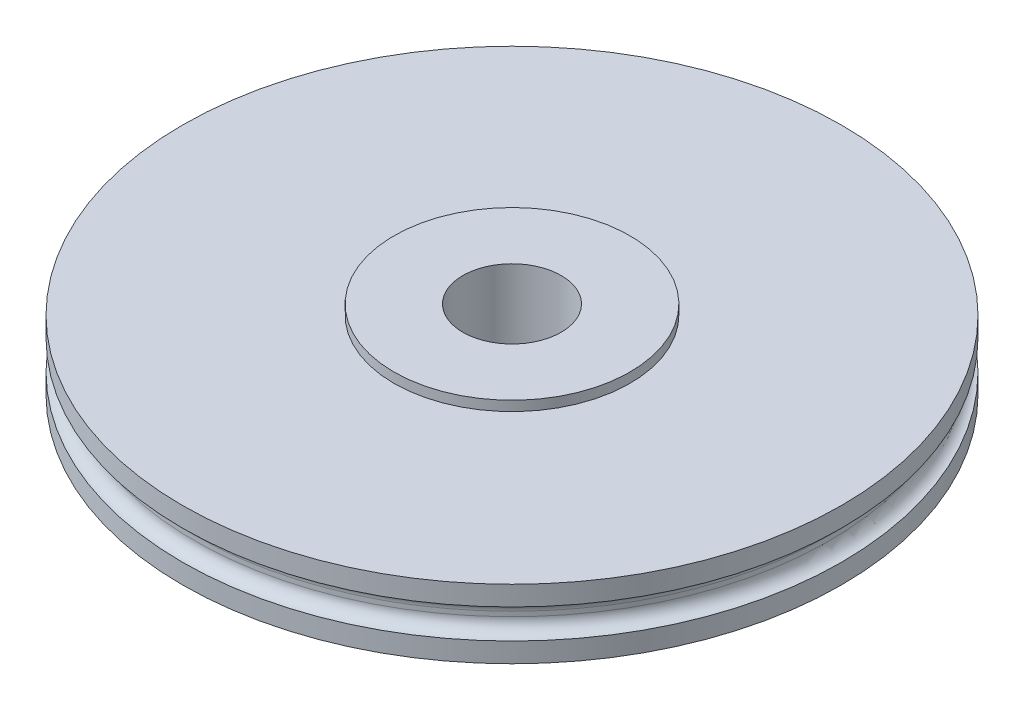
ISO-10303-21;
HEADER;
FILE_DESCRIPTION(('STEP AP214'),'2;1');
FILE_NAME('part.step','',(''),(''),'','','');
FILE_SCHEMA(('AUTOMOTIVE_DESIGN { 1 0 10303 214 1 1 1 1 }'));
ENDSEC;
DATA;
#1=APPLICATION_CONTEXT('core data for automotive mechanical design processes');
#2=APPLICATION_PROTOCOL_DEFINITION('international standard','automotive_design',2000,#1);
#3=PRODUCT_CONTEXT('',#1,'mechanical');
#4=PRODUCT('Part','Part','',(#3));
#5=PRODUCT_RELATED_PRODUCT_CATEGORY('part','',(#4));
#6=PRODUCT_DEFINITION_FORMATION('','',#4);
#7=PRODUCT_DEFINITION_CONTEXT('part definition',#1,'design');
#8=PRODUCT_DEFINITION('design','',#6,#7);
#9=PRODUCT_DEFINITION_SHAPE('','',#8);
#10=(LENGTH_UNIT() NAMED_UNIT(*) SI_UNIT(.MILLI.,.METRE.));
#11=(NAMED_UNIT(*) PLANE_ANGLE_UNIT() SI_UNIT($,.RADIAN.));
#12=(NAMED_UNIT(*) SI_UNIT($,.STERADIAN.) SOLID_ANGLE_UNIT());
#13=UNCERTAINTY_MEASURE_WITH_UNIT(LENGTH_MEASURE(1.E-05),#10,'distance_accuracy_value','');
#14=(GEOMETRIC_REPRESENTATION_CONTEXT(3) GLOBAL_UNCERTAINTY_ASSIGNED_CONTEXT((#13)) GLOBAL_UNIT_ASSIGNED_CONTEXT((#10,
#11,#12)) REPRESENTATION_CONTEXT('',''));
#15=CARTESIAN_POINT('',(0.,0.,0.));
#16=DIRECTION('',(0.,0.,1.));
#17=DIRECTION('',(1.,0.,0.));
#18=AXIS2_PLACEMENT_3D('',#15,#16,#17);
#19=CARTESIAN_POINT('',(0.,5.55625,0.));
#20=DIRECTION('',(0.,1.,0.));
#21=DIRECTION('',(0.,0.,1.));
#22=AXIS2_PLACEMENT_3D('',#19,#20,#21);
#23=PLANE('',#22);
#24=CARTESIAN_POINT('',(0.,5.55625,0.));
#25=DIRECTION('',(0.,1.,0.));
#26=DIRECTION('',(0.,0.,1.));
#27=AXIS2_PLACEMENT_3D('',#24,#25,#26);
#28=CIRCLE('',#27,26.590625);
#29=CARTESIAN_POINT('',(0.,5.55625,26.590625));
#30=VERTEX_POINT('',#29);
#31=EDGE_CURVE('E49',#30,#30,#28,.T.);
#32=ORIENTED_EDGE('',*,*,#31,.T.);
#33=EDGE_LOOP('',(#32));
#34=FACE_BOUND('',#33,.T.);
#35=CARTESIAN_POINT('',(0.,5.55625,0.));
#36=DIRECTION('',(0.,1.,0.));
#37=DIRECTION('',(0.,0.,1.));
#38=AXIS2_PLACEMENT_3D('',#35,#36,#37);
#39=CIRCLE('',#38,9.525);
#40=CARTESIAN_POINT('',(0.,5.55625,9.525));
#41=VERTEX_POINT('',#40);
#42=EDGE_CURVE('E57',#41,#41,#39,.T.);
#43=ORIENTED_EDGE('',*,*,#42,.F.);
#44=EDGE_LOOP('',(#43));
#45=FACE_BOUND('',#44,.T.);
#46=ADVANCED_FACE('F30',(#34,#45),#23,.T.);
#47=CARTESIAN_POINT('',(0.,1.5875,0.));
#48=DIRECTION('',(0.,-1.,0.));
#49=DIRECTION('',(0.,0.,-1.));
#50=AXIS2_PLACEMENT_3D('',#47,#48,#49);
#51=CYLINDRICAL_SURFACE('',#50,26.590625);
#52=CARTESIAN_POINT('',(0.,1.5875,0.));
#53=DIRECTION('',(0.,1.,0.));
#54=DIRECTION('',(0.,0.,1.));
#55=AXIS2_PLACEMENT_3D('',#52,#53,#54);
#56=CIRCLE('',#55,26.590625);
#57=CARTESIAN_POINT('',(0.,1.5875,26.590625));
#58=VERTEX_POINT('',#57);
#59=EDGE_CURVE('E41',#58,#58,#56,.T.);
#60=ORIENTED_EDGE('',*,*,#59,.F.);
#61=EDGE_LOOP('',(#60));
#62=FACE_BOUND('',#61,.T.);
#63=CARTESIAN_POINT('',(0.,0.,0.));
#64=DIRECTION('',(0.,1.,0.));
#65=DIRECTION('',(0.,0.,1.));
#66=AXIS2_PLACEMENT_3D('',#63,#64,#65);
#67=CIRCLE('',#66,26.590625);
#68=CARTESIAN_POINT('',(0.,0.,26.590625));
#69=VERTEX_POINT('',#68);
#70=EDGE_CURVE('E45',#69,#69,#67,.T.);
#71=ORIENTED_EDGE('',*,*,#70,.T.);
#72=EDGE_LOOP('',(#71));
#73=FACE_BOUND('',#72,.T.);
#74=ADVANCED_FACE('F93',(#62,#73),#51,.T.);
#75=CARTESIAN_POINT('',(0.,0.,0.));
#76=DIRECTION('',(0.,1.,0.));
#77=DIRECTION('',(0.,0.,1.));
#78=AXIS2_PLACEMENT_3D('',#75,#76,#77);
#79=PLANE('',#78);
#80=CARTESIAN_POINT('',(0.,0.,0.));
#81=DIRECTION('',(0.,1.,0.));
#82=DIRECTION('',(0.,0.,1.));
#83=AXIS2_PLACEMENT_3D('',#80,#81,#82);
#84=CIRCLE('',#83,3.96875);
#85=CARTESIAN_POINT('',(0.,0.,3.96875));
#86=VERTEX_POINT('',#85);
#87=EDGE_CURVE('E60',#86,#86,#84,.T.);
#88=ORIENTED_EDGE('',*,*,#87,.T.);
#89=EDGE_LOOP('',(#88));
#90=FACE_BOUND('',#89,.T.);
#91=ORIENTED_EDGE('',*,*,#70,.F.);
#92=EDGE_LOOP('',(#91));
#93=FACE_BOUND('',#92,.T.);
#94=ADVANCED_FACE('F69',(#90,#93),#79,.F.);
#95=CARTESIAN_POINT('',(0.,3.96875,0.));
#96=DIRECTION('',(0.,-1.,0.));
#97=DIRECTION('',(0.,0.,-1.));
#98=AXIS2_PLACEMENT_3D('',#95,#96,#97);
#99=CYLINDRICAL_SURFACE('',#98,25.5984375);
#100=CARTESIAN_POINT('',(0.,2.9687805180438,0.));
#101=DIRECTION('',(0.,1.,0.));
#102=DIRECTION('',(0.,0.,1.));
#103=AXIS2_PLACEMENT_3D('',#100,#101,#102);
#104=CIRCLE('',#103,25.5984375);
#105=CARTESIAN_POINT('',(0.,2.9687805180438,-25.5984375));
#106=VERTEX_POINT('',#105);
#107=EDGE_CURVE('E10',#106,#106,#104,.F.);
#108=CARTESIAN_POINT('',(0.,2.5874694819562,0.));
#109=DIRECTION('',(0.,-1.,0.));
#110=DIRECTION('',(0.,0.,-1.));
#111=AXIS2_PLACEMENT_3D('',#108,#109,#110);
#112=CIRCLE('',#111,25.5984375);
#113=CARTESIAN_POINT('',(0.,2.5874694819562,-25.5984375));
#114=VERTEX_POINT('',#113);
#115=EDGE_CURVE('E37',#114,#114,#112,.F.);
#116=CARTESIAN_POINT('',(0.,2.9687805180438,-25.5984375));
#117=CARTESIAN_POINT('',(0.,2.96480852808455,-25.5984375));
#118=CARTESIAN_POINT('',(0.,2.96083653812531,-25.5984375));
#119=CARTESIAN_POINT('',(0.,2.95289255820682,-25.5984375));
#120=CARTESIAN_POINT('',(0.,2.94892056824757,-25.5984375));
#121=CARTESIAN_POINT('',(0.,2.94097658832908,-25.5984375));
#122=CARTESIAN_POINT('',(0.,2.93700459836983,-25.5984375));
#123=CARTESIAN_POINT('',(0.,2.92906061845134,-25.5984375));
#124=CARTESIAN_POINT('',(0.,2.9250886284921,-25.5984375));
#125=CARTESIAN_POINT('',(0.,2.9171446485736,-25.5984375));
#126=CARTESIAN_POINT('',(0.,2.91317265861436,-25.5984375));
#127=CARTESIAN_POINT('',(0.,2.90522867869587,-25.5984375));
#128=CARTESIAN_POINT('',(0.,2.90125668873662,-25.5984375));
#129=CARTESIAN_POINT('',(0.,2.89331270881813,-25.5984375));
#130=CARTESIAN_POINT('',(0.,2.88934071885888,-25.5984375));
#131=CARTESIAN_POINT('',(0.,2.88139673894039,-25.5984375));
#132=CARTESIAN_POINT('',(0.,2.87742474898115,-25.5984375));
#133=CARTESIAN_POINT('',(0.,2.86948076906265,-25.5984375));
#134=CARTESIAN_POINT('',(0.,2.86550877910341,-25.5984375));
#135=CARTESIAN_POINT('',(0.,2.85756479918492,-25.5984375));
#136=CARTESIAN_POINT('',(0.,2.85359280922567,-25.5984375));
#137=CARTESIAN_POINT('',(0.,2.84564882930718,-25.5984375));
#138=CARTESIAN_POINT('',(0.,2.84167683934793,-25.5984375));
#139=CARTESIAN_POINT('',(0.,2.83373285942944,-25.5984375));
#140=CARTESIAN_POINT('',(0.,2.8297608694702,-25.5984375));
#141=CARTESIAN_POINT('',(0.,2.8218168895517,-25.5984375));
#142=CARTESIAN_POINT('',(0.,2.81784489959246,-25.5984375));
#143=CARTESIAN_POINT('',(0.,2.80990091967397,-25.5984375));
#144=CARTESIAN_POINT('',(0.,2.80592892971472,-25.5984375));
#145=CARTESIAN_POINT('',(0.,2.79798494979623,-25.5984375));
#146=CARTESIAN_POINT('',(0.,2.79401295983698,-25.5984375));
#147=CARTESIAN_POINT('',(0.,2.78606897991849,-25.5984375));
#148=CARTESIAN_POINT('',(0.,2.78209698995925,-25.5984375));
#149=CARTESIAN_POINT('',(0.,2.77415301004075,-25.5984375));
#150=CARTESIAN_POINT('',(0.,2.77018102008151,-25.5984375));
#151=CARTESIAN_POINT('',(0.,2.76223704016302,-25.5984375));
#152=CARTESIAN_POINT('',(0.,2.75826505020377,-25.5984375));
#153=CARTESIAN_POINT('',(0.,2.75032107028528,-25.5984375));
#154=CARTESIAN_POINT('',(0.,2.74634908032603,-25.5984375));
#155=CARTESIAN_POINT('',(0.,2.73840510040754,-25.5984375));
#156=CARTESIAN_POINT('',(0.,2.7344331104483,-25.5984375));
#157=CARTESIAN_POINT('',(0.,2.7264891305298,-25.5984375));
#158=CARTESIAN_POINT('',(0.,2.72251714057056,-25.5984375));
#159=CARTESIAN_POINT('',(0.,2.71457316065207,-25.5984375));
#160=CARTESIAN_POINT('',(0.,2.71060117069282,-25.5984375));
#161=CARTESIAN_POINT('',(0.,2.70265719077433,-25.5984375));
#162=CARTESIAN_POINT('',(0.,2.69868520081508,-25.5984375));
#163=CARTESIAN_POINT('',(0.,2.69074122089659,-25.5984375));
#164=CARTESIAN_POINT('',(0.,2.68676923093735,-25.5984375));
#165=CARTESIAN_POINT('',(0.,2.67882525101885,-25.5984375));
#166=CARTESIAN_POINT('',(0.,2.67485326105961,-25.5984375));
#167=CARTESIAN_POINT('',(0.,2.66690928114112,-25.5984375));
#168=CARTESIAN_POINT('',(0.,2.66293729118187,-25.5984375));
#169=CARTESIAN_POINT('',(0.,2.65499331126338,-25.5984375));
#170=CARTESIAN_POINT('',(0.,2.65102132130413,-25.5984375));
#171=CARTESIAN_POINT('',(0.,2.64307734138564,-25.5984375));
#172=CARTESIAN_POINT('',(0.,2.63910535142639,-25.5984375));
#173=CARTESIAN_POINT('',(0.,2.6311613715079,-25.5984375));
#174=CARTESIAN_POINT('',(0.,2.62718938154866,-25.5984375));
#175=CARTESIAN_POINT('',(0.,2.61924540163017,-25.5984375));
#176=CARTESIAN_POINT('',(0.,2.61527341167092,-25.5984375));
#177=CARTESIAN_POINT('',(0.,2.60732943175243,-25.5984375));
#178=CARTESIAN_POINT('',(0.,2.60335744179318,-25.5984375));
#179=CARTESIAN_POINT('',(0.,2.59541346187469,-25.5984375));
#180=CARTESIAN_POINT('',(0.,2.59144147191545,-25.5984375));
#181=CARTESIAN_POINT('',(0.,2.5874694819562,-25.5984375));
#182=B_SPLINE_CURVE_WITH_KNOTS('',3,(#116,#117,#118,#119,#120,#121,#122,#123,#124,#125,#126,
#127,#128,#129,#130,#131,#132,#133,#134,#135,#136,#137,#138,#139,#140,#141,#142,#143,#144,#145,
#146,#147,#148,#149,#150,#151,#152,#153,#154,#155,#156,#157,#158,#159,#160,#161,#162,#163,#164,
#165,#166,#167,#168,#169,#170,#171,#172,#173,#174,#175,#176,#177,#178,#179,#180,#181),
.UNSPECIFIED.,.F.,.F.,(4,2,2,2,2,2,2,2,2,2,2,2,2,2,2,2,2,2,2,2,2,2,2,2,2,2,2,2,2,2,2,2,4),(0.,
0.0119159698777375,0.023831939755475,0.0357479096332125,0.0476638795109501,0.0595798493886876,
0.0714958192664251,0.0834117891441626,0.0953277590219001,0.107243728899638,0.119159698777376,
0.131075668655113,0.142991638532851,0.154907608410588,0.166823578288326,0.178739548166063,
0.190655518043801,0.202571487921538,0.214487457799276,0.226403427677013,0.238319397554751,
0.250235367432488,0.262151337310226,0.274067307187964,0.285983277065701,0.297899246943439,
0.309815216821176,0.321731186698914,0.333647156576651,0.345563126454389,0.357479096332126,
0.369395066209864,0.381311036087601),.UNSPECIFIED.);
#183=EDGE_CURVE('BSEAM104',#106,#114,#182,.T.);
#184=ORIENTED_EDGE('',*,*,#107,.T.);
#185=ORIENTED_EDGE('',*,*,#115,.T.);
#186=ORIENTED_EDGE('',*,*,#183,.T.);
#187=ORIENTED_EDGE('',*,*,#183,.F.);
#188=EDGE_LOOP('',(#184,#186,#185,#187));
#189=FACE_BOUND('',#188,.T.);
#190=ADVANCED_FACE('F104',(#189),#99,.T.);
#191=CARTESIAN_POINT('',(0.,5.55625,0.));
#192=DIRECTION('',(0.,-1.,0.));
#193=DIRECTION('',(0.,0.,-1.));
#194=AXIS2_PLACEMENT_3D('',#191,#192,#193);
#195=CYLINDRICAL_SURFACE('',#194,26.590625);
#196=ORIENTED_EDGE('',*,*,#31,.F.);
#197=EDGE_LOOP('',(#196));
#198=FACE_BOUND('',#197,.T.);
#199=CARTESIAN_POINT('',(0.,3.96875,0.));
#200=DIRECTION('',(0.,1.,0.));
#201=DIRECTION('',(0.,0.,1.));
#202=AXIS2_PLACEMENT_3D('',#199,#200,#201);
#203=CIRCLE('',#202,26.590625);
#204=CARTESIAN_POINT('',(0.,3.96875,26.590625));
#205=VERTEX_POINT('',#204);
#206=EDGE_CURVE('E51',#205,#205,#203,.T.);
#207=ORIENTED_EDGE('',*,*,#206,.T.);
#208=EDGE_LOOP('',(#207));
#209=FACE_BOUND('',#208,.T.);
#210=ADVANCED_FACE('F88',(#198,#209),#195,.T.);
#211=CARTESIAN_POINT('',(0.,6.35,0.));
#212=DIRECTION('',(0.,-1.,0.));
#213=DIRECTION('',(0.,0.,-1.));
#214=AXIS2_PLACEMENT_3D('',#211,#212,#213);
#215=CYLINDRICAL_SURFACE('',#214,9.525);
#216=CARTESIAN_POINT('',(0.,6.35,0.));
#217=DIRECTION('',(0.,1.,0.));
#218=DIRECTION('',(0.,0.,1.));
#219=AXIS2_PLACEMENT_3D('',#216,#217,#218);
#220=CIRCLE('',#219,9.525);
#221=CARTESIAN_POINT('',(0.,6.35,9.525));
#222=VERTEX_POINT('',#221);
#223=EDGE_CURVE('E54',#222,#222,#220,.T.);
#224=ORIENTED_EDGE('',*,*,#223,.F.);
#225=EDGE_LOOP('',(#224));
#226=FACE_BOUND('',#225,.T.);
#227=ORIENTED_EDGE('',*,*,#42,.T.);
#228=EDGE_LOOP('',(#227));
#229=FACE_BOUND('',#228,.T.);
#230=ADVANCED_FACE('F82',(#226,#229),#215,.T.);
#231=CARTESIAN_POINT('',(0.,6.35,0.));
#232=DIRECTION('',(0.,1.,0.));
#233=DIRECTION('',(0.,0.,1.));
#234=AXIS2_PLACEMENT_3D('',#231,#232,#233);
#235=PLANE('',#234);
#236=CARTESIAN_POINT('',(0.,6.35,0.));
#237=DIRECTION('',(0.,1.,0.));
#238=DIRECTION('',(0.,0.,1.));
#239=AXIS2_PLACEMENT_3D('',#236,#237,#238);
#240=CIRCLE('',#239,3.96875);
#241=CARTESIAN_POINT('',(0.,6.35,3.96875));
#242=VERTEX_POINT('',#241);
#243=EDGE_CURVE('E63',#242,#242,#240,.T.);
#244=ORIENTED_EDGE('',*,*,#243,.F.);
#245=EDGE_LOOP('',(#244));
#246=FACE_BOUND('',#245,.T.);
#247=ORIENTED_EDGE('',*,*,#223,.T.);
#248=EDGE_LOOP('',(#247));
#249=FACE_BOUND('',#248,.T.);
#250=ADVANCED_FACE('F76',(#246,#249),#235,.T.);
#251=CARTESIAN_POINT('',(0.,0.,0.));
#252=DIRECTION('',(0.,1.,0.));
#253=DIRECTION('',(0.,0.,1.));
#254=AXIS2_PLACEMENT_3D('',#251,#252,#253);
#255=CYLINDRICAL_SURFACE('',#254,3.96875);
#256=ORIENTED_EDGE('',*,*,#87,.F.);
#257=EDGE_LOOP('',(#256));
#258=FACE_BOUND('',#257,.T.);
#259=ORIENTED_EDGE('',*,*,#243,.T.);
#260=EDGE_LOOP('',(#259));
#261=FACE_BOUND('',#260,.T.);
#262=ADVANCED_FACE('F72',(#258,#261),#255,.F.);
#263=CARTESIAN_POINT('',(0.,2.5874694819562,0.));
#264=DIRECTION('',(0.,-1.,0.));
#265=DIRECTION('',(0.,0.,-1.));
#266=AXIS2_PLACEMENT_3D('',#263,#264,#265);
#267=TOROIDAL_SURFACE('',#266,26.5984375,1.);
#268=ORIENTED_EDGE('',*,*,#59,.T.);
#269=EDGE_LOOP('',(#268));
#270=FACE_BOUND('',#269,.T.);
#271=ORIENTED_EDGE('',*,*,#115,.F.);
#272=EDGE_LOOP('',(#271));
#273=FACE_BOUND('',#272,.T.);
#274=ADVANCED_FACE('F75',(#270,#273),#267,.F.);
#275=CARTESIAN_POINT('',(0.,2.9687805180438,0.));
#276=DIRECTION('',(0.,1.,0.));
#277=DIRECTION('',(0.,0.,1.));
#278=AXIS2_PLACEMENT_3D('',#275,#276,#277);
#279=TOROIDAL_SURFACE('',#278,26.5984375,1.);
#280=ORIENTED_EDGE('',*,*,#107,.F.);
#281=EDGE_LOOP('',(#280));
#282=FACE_BOUND('',#281,.T.);
#283=ORIENTED_EDGE('',*,*,#206,.F.);
#284=EDGE_LOOP('',(#283));
#285=FACE_BOUND('',#284,.T.);
#286=ADVANCED_FACE('F32',(#282,#285),#279,.F.);
#287=CLOSED_SHELL('',(#46,#74,#94,#190,#210,#230,#250,#262,#274,#286));
#288=MANIFOLD_SOLID_BREP('B2',#287);
#289=ADVANCED_BREP_SHAPE_REPRESENTATION('',(#18,#288),#14);
#290=SHAPE_DEFINITION_REPRESENTATION(#9,#289);
ENDSEC;
END-ISO-10303-21;
